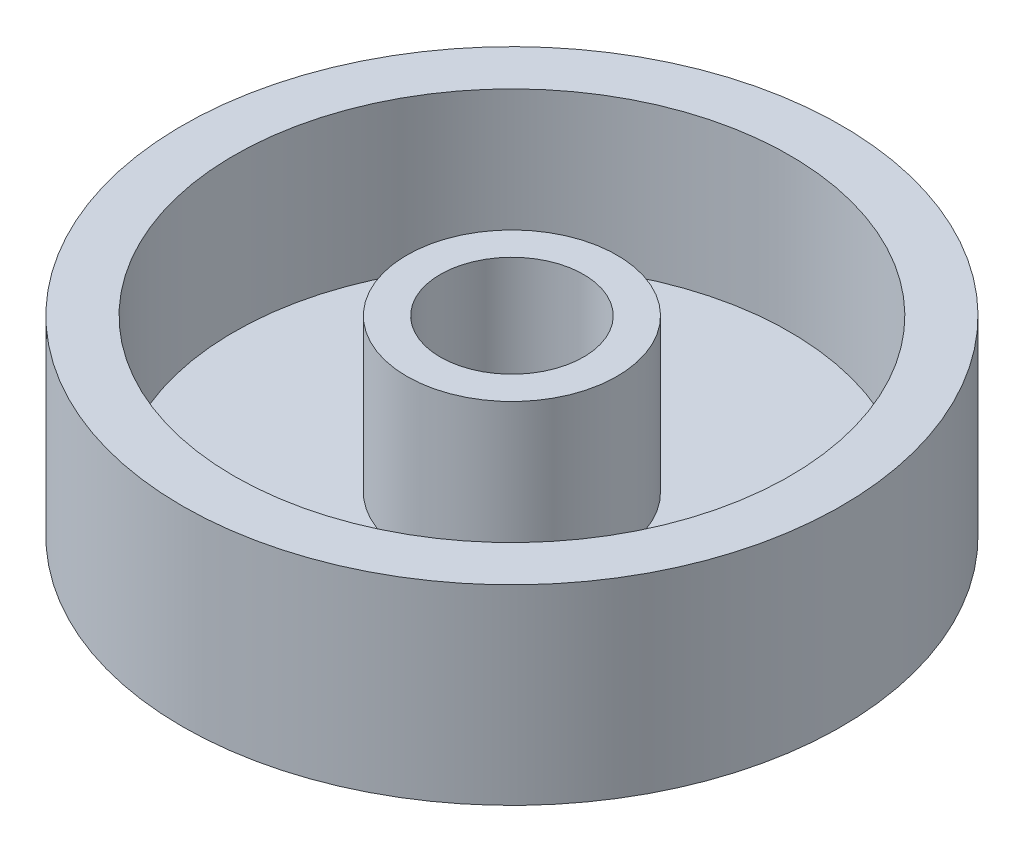
ISO-10303-21;
HEADER;
FILE_DESCRIPTION(('STEP AP214'),'2;1');
FILE_NAME('part.step','',(''),(''),'','','');
FILE_SCHEMA(('AUTOMOTIVE_DESIGN { 1 0 10303 214 1 1 1 1 }'));
ENDSEC;
DATA;
#1=APPLICATION_CONTEXT('core data for automotive mechanical design processes');
#2=APPLICATION_PROTOCOL_DEFINITION('international standard','automotive_design',2000,#1);
#3=PRODUCT_CONTEXT('',#1,'mechanical');
#4=PRODUCT('Part','Part','',(#3));
#5=PRODUCT_RELATED_PRODUCT_CATEGORY('part','',(#4));
#6=PRODUCT_DEFINITION_FORMATION('','',#4);
#7=PRODUCT_DEFINITION_CONTEXT('part definition',#1,'design');
#8=PRODUCT_DEFINITION('design','',#6,#7);
#9=PRODUCT_DEFINITION_SHAPE('','',#8);
#10=(LENGTH_UNIT() NAMED_UNIT(*) SI_UNIT(.MILLI.,.METRE.));
#11=(NAMED_UNIT(*) PLANE_ANGLE_UNIT() SI_UNIT($,.RADIAN.));
#12=(NAMED_UNIT(*) SI_UNIT($,.STERADIAN.) SOLID_ANGLE_UNIT());
#13=UNCERTAINTY_MEASURE_WITH_UNIT(LENGTH_MEASURE(1.E-05),#10,'distance_accuracy_value','');
#14=(GEOMETRIC_REPRESENTATION_CONTEXT(3) GLOBAL_UNCERTAINTY_ASSIGNED_CONTEXT((#13)) GLOBAL_UNIT_ASSIGNED_CONTEXT((#10,
#11,#12)) REPRESENTATION_CONTEXT('',''));
#15=CARTESIAN_POINT('',(0.,0.,0.));
#16=DIRECTION('',(0.,0.,1.));
#17=DIRECTION('',(1.,0.,0.));
#18=AXIS2_PLACEMENT_3D('',#15,#16,#17);
#19=CARTESIAN_POINT('',(0.,4.,0.));
#20=DIRECTION('',(0.,-1.,0.));
#21=DIRECTION('',(0.,0.,-1.));
#22=AXIS2_PLACEMENT_3D('',#19,#20,#21);
#23=CYLINDRICAL_SURFACE('',#22,6.9);
#24=CARTESIAN_POINT('',(0.,4.,0.));
#25=DIRECTION('',(0.,1.,0.));
#26=DIRECTION('',(0.,0.,1.));
#27=AXIS2_PLACEMENT_3D('',#24,#25,#26);
#28=CIRCLE('',#27,6.9);
#29=CARTESIAN_POINT('',(0.,4.,6.9));
#30=VERTEX_POINT('',#29);
#31=EDGE_CURVE('E10',#30,#30,#28,.T.);
#32=ORIENTED_EDGE('',*,*,#31,.F.);
#33=EDGE_LOOP('',(#32));
#34=FACE_BOUND('',#33,.T.);
#35=CARTESIAN_POINT('',(0.,0.,0.));
#36=DIRECTION('',(0.,1.,0.));
#37=DIRECTION('',(0.,0.,1.));
#38=AXIS2_PLACEMENT_3D('',#35,#36,#37);
#39=CIRCLE('',#38,6.9);
#40=CARTESIAN_POINT('',(0.,0.,6.9));
#41=VERTEX_POINT('',#40);
#42=EDGE_CURVE('E33',#41,#41,#39,.T.);
#43=ORIENTED_EDGE('',*,*,#42,.T.);
#44=EDGE_LOOP('',(#43));
#45=FACE_BOUND('',#44,.T.);
#46=ADVANCED_FACE('F30',(#34,#45),#23,.T.);
#47=CARTESIAN_POINT('',(0.,4.,0.));
#48=DIRECTION('',(0.,1.,0.));
#49=DIRECTION('',(0.,0.,1.));
#50=AXIS2_PLACEMENT_3D('',#47,#48,#49);
#51=PLANE('',#50);
#52=CARTESIAN_POINT('',(0.,4.,0.));
#53=DIRECTION('',(0.,1.,0.));
#54=DIRECTION('',(0.,0.,1.));
#55=AXIS2_PLACEMENT_3D('',#52,#53,#54);
#56=CIRCLE('',#55,5.81713515235824);
#57=CARTESIAN_POINT('',(0.,4.,5.81713515235824));
#58=VERTEX_POINT('',#57);
#59=EDGE_CURVE('E42',#58,#58,#56,.T.);
#60=ORIENTED_EDGE('',*,*,#59,.F.);
#61=EDGE_LOOP('',(#60));
#62=FACE_BOUND('',#61,.T.);
#63=ORIENTED_EDGE('',*,*,#31,.T.);
#64=EDGE_LOOP('',(#63));
#65=FACE_BOUND('',#64,.T.);
#66=ADVANCED_FACE('F74',(#62,#65),#51,.T.);
#67=CARTESIAN_POINT('',(0.,0.,0.));
#68=DIRECTION('',(0.,1.,0.));
#69=DIRECTION('',(0.,0.,1.));
#70=AXIS2_PLACEMENT_3D('',#67,#68,#69);
#71=PLANE('',#70);
#72=CARTESIAN_POINT('',(0.,0.,0.));
#73=DIRECTION('',(0.,1.,0.));
#74=DIRECTION('',(0.,0.,1.));
#75=AXIS2_PLACEMENT_3D('',#72,#73,#74);
#76=CIRCLE('',#75,1.5);
#77=CARTESIAN_POINT('',(0.,0.,1.5));
#78=VERTEX_POINT('',#77);
#79=EDGE_CURVE('E51',#78,#78,#76,.T.);
#80=ORIENTED_EDGE('',*,*,#79,.T.);
#81=EDGE_LOOP('',(#80));
#82=FACE_BOUND('',#81,.T.);
#83=ORIENTED_EDGE('',*,*,#42,.F.);
#84=EDGE_LOOP('',(#83));
#85=FACE_BOUND('',#84,.T.);
#86=ADVANCED_FACE('F60',(#82,#85),#71,.F.);
#87=CARTESIAN_POINT('',(0.,0.8,0.));
#88=DIRECTION('',(0.,1.,0.));
#89=DIRECTION('',(0.,0.,1.));
#90=AXIS2_PLACEMENT_3D('',#87,#88,#89);
#91=CYLINDRICAL_SURFACE('',#90,5.81713515235824);
#92=CARTESIAN_POINT('',(0.,0.8,0.));
#93=DIRECTION('',(0.,1.,0.));
#94=DIRECTION('',(0.,0.,1.));
#95=AXIS2_PLACEMENT_3D('',#92,#93,#94);
#96=CIRCLE('',#95,5.81713515235824);
#97=CARTESIAN_POINT('',(0.,0.8,5.81713515235824));
#98=VERTEX_POINT('',#97);
#99=EDGE_CURVE('E40',#98,#98,#96,.T.);
#100=ORIENTED_EDGE('',*,*,#99,.F.);
#101=EDGE_LOOP('',(#100));
#102=FACE_BOUND('',#101,.T.);
#103=ORIENTED_EDGE('',*,*,#59,.T.);
#104=EDGE_LOOP('',(#103));
#105=FACE_BOUND('',#104,.T.);
#106=ADVANCED_FACE('F84',(#102,#105),#91,.F.);
#107=CARTESIAN_POINT('',(0.,0.8,0.));
#108=DIRECTION('',(0.,1.,0.));
#109=DIRECTION('',(0.,0.,1.));
#110=AXIS2_PLACEMENT_3D('',#107,#108,#109);
#111=PLANE('',#110);
#112=CARTESIAN_POINT('',(0.,0.8,0.));
#113=DIRECTION('',(0.,1.,0.));
#114=DIRECTION('',(0.,0.,1.));
#115=AXIS2_PLACEMENT_3D('',#112,#113,#114);
#116=CIRCLE('',#115,2.2);
#117=CARTESIAN_POINT('',(0.,0.8,2.2));
#118=VERTEX_POINT('',#117);
#119=EDGE_CURVE('E45',#118,#118,#116,.T.);
#120=ORIENTED_EDGE('',*,*,#119,.F.);
#121=EDGE_LOOP('',(#120));
#122=FACE_BOUND('',#121,.T.);
#123=ORIENTED_EDGE('',*,*,#99,.T.);
#124=EDGE_LOOP('',(#123));
#125=FACE_BOUND('',#124,.T.);
#126=ADVANCED_FACE('F78',(#122,#125),#111,.T.);
#127=CARTESIAN_POINT('',(0.,0.8,0.));
#128=DIRECTION('',(0.,1.,0.));
#129=DIRECTION('',(0.,0.,1.));
#130=AXIS2_PLACEMENT_3D('',#127,#128,#129);
#131=CYLINDRICAL_SURFACE('',#130,2.2);
#132=ORIENTED_EDGE('',*,*,#119,.T.);
#133=EDGE_LOOP('',(#132));
#134=FACE_BOUND('',#133,.T.);
#135=CARTESIAN_POINT('',(0.,4.,0.));
#136=DIRECTION('',(0.,1.,0.));
#137=DIRECTION('',(0.,0.,1.));
#138=AXIS2_PLACEMENT_3D('',#135,#136,#137);
#139=CIRCLE('',#138,2.2);
#140=CARTESIAN_POINT('',(0.,4.,2.2));
#141=VERTEX_POINT('',#140);
#142=EDGE_CURVE('E48',#141,#141,#139,.T.);
#143=ORIENTED_EDGE('',*,*,#142,.F.);
#144=EDGE_LOOP('',(#143));
#145=FACE_BOUND('',#144,.T.);
#146=ADVANCED_FACE('F72',(#134,#145),#131,.T.);
#147=CARTESIAN_POINT('',(0.,4.,0.));
#148=DIRECTION('',(0.,1.,0.));
#149=DIRECTION('',(0.,0.,1.));
#150=AXIS2_PLACEMENT_3D('',#147,#148,#149);
#151=CIRCLE('',#150,1.5);
#152=CARTESIAN_POINT('',(0.,4.,1.5));
#153=VERTEX_POINT('',#152);
#154=EDGE_CURVE('E54',#153,#153,#151,.T.);
#155=ORIENTED_EDGE('',*,*,#154,.F.);
#156=EDGE_LOOP('',(#155));
#157=FACE_BOUND('',#156,.T.);
#158=ORIENTED_EDGE('',*,*,#142,.T.);
#159=EDGE_LOOP('',(#158));
#160=FACE_BOUND('',#159,.T.);
#161=ADVANCED_FACE('F66',(#157,#160),#51,.T.);
#162=CARTESIAN_POINT('',(0.,0.,0.));
#163=DIRECTION('',(0.,1.,0.));
#164=DIRECTION('',(0.,0.,1.));
#165=AXIS2_PLACEMENT_3D('',#162,#163,#164);
#166=CYLINDRICAL_SURFACE('',#165,1.5);
#167=ORIENTED_EDGE('',*,*,#79,.F.);
#168=EDGE_LOOP('',(#167));
#169=FACE_BOUND('',#168,.T.);
#170=ORIENTED_EDGE('',*,*,#154,.T.);
#171=EDGE_LOOP('',(#170));
#172=FACE_BOUND('',#171,.T.);
#173=ADVANCED_FACE('F63',(#169,#172),#166,.F.);
#174=CLOSED_SHELL('',(#46,#66,#86,#106,#126,#146,#161,#173));
#175=MANIFOLD_SOLID_BREP('B2',#174);
#176=ADVANCED_BREP_SHAPE_REPRESENTATION('',(#18,#175),#14);
#177=SHAPE_DEFINITION_REPRESENTATION(#9,#176);
ENDSEC;
END-ISO-10303-21;
